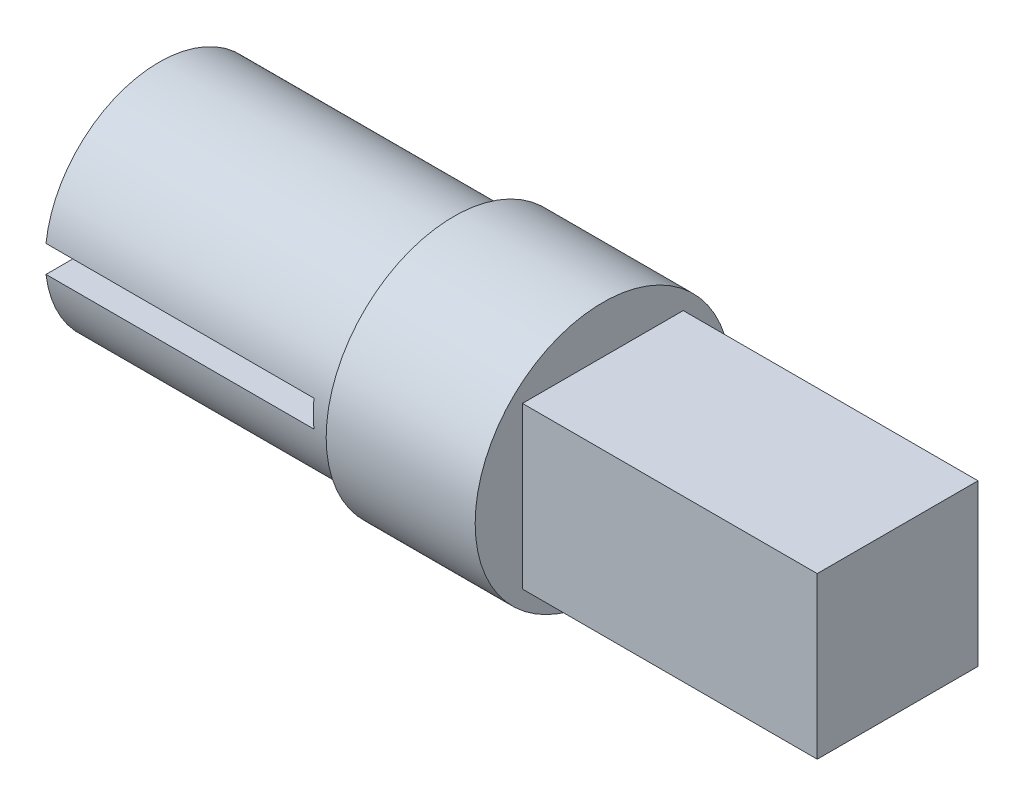
ISO-10303-21;
HEADER;
FILE_DESCRIPTION(('STEP AP214'),'2;1');
FILE_NAME('part.step','',(''),(''),'','','');
FILE_SCHEMA(('AUTOMOTIVE_DESIGN { 1 0 10303 214 1 1 1 1 }'));
ENDSEC;
DATA;
#1=APPLICATION_CONTEXT('core data for automotive mechanical design processes');
#2=APPLICATION_PROTOCOL_DEFINITION('international standard','automotive_design',2000,#1);
#3=PRODUCT_CONTEXT('',#1,'mechanical');
#4=PRODUCT('Part','Part','',(#3));
#5=PRODUCT_RELATED_PRODUCT_CATEGORY('part','',(#4));
#6=PRODUCT_DEFINITION_FORMATION('','',#4);
#7=PRODUCT_DEFINITION_CONTEXT('part definition',#1,'design');
#8=PRODUCT_DEFINITION('design','',#6,#7);
#9=PRODUCT_DEFINITION_SHAPE('','',#8);
#10=(LENGTH_UNIT() NAMED_UNIT(*) SI_UNIT(.MILLI.,.METRE.));
#11=(NAMED_UNIT(*) PLANE_ANGLE_UNIT() SI_UNIT($,.RADIAN.));
#12=(NAMED_UNIT(*) SI_UNIT($,.STERADIAN.) SOLID_ANGLE_UNIT());
#13=UNCERTAINTY_MEASURE_WITH_UNIT(LENGTH_MEASURE(1.E-05),#10,'distance_accuracy_value','');
#14=(GEOMETRIC_REPRESENTATION_CONTEXT(3) GLOBAL_UNCERTAINTY_ASSIGNED_CONTEXT((#13)) GLOBAL_UNIT_ASSIGNED_CONTEXT((#10,
#11,#12)) REPRESENTATION_CONTEXT('',''));
#15=CARTESIAN_POINT('',(0.,0.,0.));
#16=DIRECTION('',(0.,0.,1.));
#17=DIRECTION('',(1.,0.,0.));
#18=AXIS2_PLACEMENT_3D('',#15,#16,#17);
#19=CARTESIAN_POINT('',(-13.78,0.,0.));
#20=DIRECTION('',(1.,0.,0.));
#21=DIRECTION('',(0.,0.,-1.));
#22=AXIS2_PLACEMENT_3D('',#19,#20,#21);
#23=CYLINDRICAL_SURFACE('',#22,4.25);
#24=CARTESIAN_POINT('',(-2.78,0.,0.));
#25=DIRECTION('',(-1.,0.,0.));
#26=DIRECTION('',(0.,0.,1.));
#27=AXIS2_PLACEMENT_3D('',#24,#25,#26);
#28=CIRCLE('',#27,4.25);
#29=CARTESIAN_POINT('',(-2.78,0.,4.25));
#30=VERTEX_POINT('',#29);
#31=EDGE_CURVE('E157',#30,#30,#28,.T.);
#32=ORIENTED_EDGE('',*,*,#31,.T.);
#33=EDGE_LOOP('',(#32));
#34=FACE_BOUND('',#33,.T.);
#35=DIRECTION('',(1.,0.,0.));
#36=VECTOR('',#35,1.);
#37=CARTESIAN_POINT('',(-13.78,0.5,-4.22048575403353));
#38=LINE('',#37,#36);
#39=CARTESIAN_POINT('',(-13.78,0.5,-4.22048575403353));
#40=VERTEX_POINT('',#39);
#41=CARTESIAN_POINT('',(-3.77999999999999,0.5,-4.22048575403353));
#42=VERTEX_POINT('',#41);
#43=EDGE_CURVE('E124',#40,#42,#38,.T.);
#44=ORIENTED_EDGE('',*,*,#43,.F.);
#45=CARTESIAN_POINT('',(-13.78,0.,0.));
#46=DIRECTION('',(-1.,0.,0.));
#47=DIRECTION('',(0.,0.,1.));
#48=AXIS2_PLACEMENT_3D('',#45,#46,#47);
#49=CIRCLE('',#48,4.25);
#50=CARTESIAN_POINT('',(-13.78,0.5,4.22048575403353));
#51=VERTEX_POINT('',#50);
#52=EDGE_CURVE('E138',#51,#40,#49,.T.);
#53=ORIENTED_EDGE('',*,*,#52,.F.);
#54=DIRECTION('',(1.,0.,0.));
#55=VECTOR('',#54,1.);
#56=CARTESIAN_POINT('',(-13.78,0.5,4.22048575403353));
#57=LINE('',#56,#55);
#58=CARTESIAN_POINT('',(-3.77999999999999,0.5,4.22048575403353));
#59=VERTEX_POINT('',#58);
#60=EDGE_CURVE('E142',#59,#51,#57,.F.);
#61=ORIENTED_EDGE('',*,*,#60,.F.);
#62=CARTESIAN_POINT('',(-3.77999999999999,0.,0.));
#63=DIRECTION('',(-1.,0.,0.));
#64=DIRECTION('',(0.,0.,1.));
#65=AXIS2_PLACEMENT_3D('',#62,#63,#64);
#66=CIRCLE('',#65,4.25);
#67=CARTESIAN_POINT('',(-3.77999999999999,-0.5,4.22048575403353));
#68=VERTEX_POINT('',#67);
#69=EDGE_CURVE('E304',#68,#59,#66,.T.);
#70=ORIENTED_EDGE('',*,*,#69,.F.);
#71=DIRECTION('',(1.,0.,0.));
#72=VECTOR('',#71,1.);
#73=CARTESIAN_POINT('',(-13.78,-0.5,4.22048575403353));
#74=LINE('',#73,#72);
#75=CARTESIAN_POINT('',(-13.78,-0.5,4.22048575403353));
#76=VERTEX_POINT('',#75);
#77=EDGE_CURVE('E311',#68,#76,#74,.F.);
#78=ORIENTED_EDGE('',*,*,#77,.T.);
#79=CARTESIAN_POINT('',(-13.78,-0.5,-4.22048575403353));
#80=VERTEX_POINT('',#79);
#81=EDGE_CURVE('E147',#80,#76,#49,.T.);
#82=ORIENTED_EDGE('',*,*,#81,.F.);
#83=DIRECTION('',(1.,0.,0.));
#84=VECTOR('',#83,1.);
#85=CARTESIAN_POINT('',(-13.78,-0.5,-4.22048575403353));
#86=LINE('',#85,#84);
#87=CARTESIAN_POINT('',(-3.77999999999999,-0.5,-4.22048575403353));
#88=VERTEX_POINT('',#87);
#89=EDGE_CURVE('E310',#80,#88,#86,.T.);
#90=ORIENTED_EDGE('',*,*,#89,.T.);
#91=EDGE_CURVE('E140',#42,#88,#66,.T.);
#92=ORIENTED_EDGE('',*,*,#91,.F.);
#93=EDGE_LOOP('',(#44,#53,#61,#70,#78,#82,#90,#92));
#94=FACE_BOUND('',#93,.T.);
#95=ADVANCED_FACE('F33',(#34,#94),#23,.T.);
#96=CARTESIAN_POINT('',(-13.78,0.,0.));
#97=DIRECTION('',(-1.,0.,0.));
#98=DIRECTION('',(0.,0.,1.));
#99=AXIS2_PLACEMENT_3D('',#96,#97,#98);
#100=PLANE('',#99);
#101=ORIENTED_EDGE('',*,*,#52,.T.);
#102=DIRECTION('',(0.,0.,1.));
#103=VECTOR('',#102,1.);
#104=CARTESIAN_POINT('',(-13.78,0.5,0.));
#105=LINE('',#104,#103);
#106=CARTESIAN_POINT('',(-13.78,0.5,-2.80579756931964));
#107=VERTEX_POINT('',#106);
#108=EDGE_CURVE('E120',#40,#107,#105,.T.);
#109=ORIENTED_EDGE('',*,*,#108,.T.);
#110=CARTESIAN_POINT('',(-13.78,0.,0.));
#111=DIRECTION('',(-1.,0.,0.));
#112=DIRECTION('',(0.,0.,1.));
#113=AXIS2_PLACEMENT_3D('',#110,#111,#112);
#114=CIRCLE('',#113,2.85);
#115=CARTESIAN_POINT('',(-13.78,0.5,2.80579756931964));
#116=VERTEX_POINT('',#115);
#117=EDGE_CURVE('E180',#116,#107,#114,.T.);
#118=ORIENTED_EDGE('',*,*,#117,.F.);
#119=EDGE_CURVE('E132',#116,#51,#105,.T.);
#120=ORIENTED_EDGE('',*,*,#119,.T.);
#121=EDGE_LOOP('',(#101,#109,#118,#120));
#122=FACE_BOUND('',#121,.T.);
#123=ADVANCED_FACE('F145',(#122),#100,.T.);
#124=CARTESIAN_POINT('',(5.28101730552664,0.,0.));
#125=DIRECTION('',(-1.,0.,0.));
#126=DIRECTION('',(0.,0.,1.));
#127=AXIS2_PLACEMENT_3D('',#124,#125,#126);
#128=CYLINDRICAL_SURFACE('',#127,2.85);
#129=CARTESIAN_POINT('',(-2.78,0.,0.));
#130=DIRECTION('',(1.,0.,0.));
#131=DIRECTION('',(0.,0.,-1.));
#132=AXIS2_PLACEMENT_3D('',#129,#130,#131);
#133=CIRCLE('',#132,2.85);
#134=CARTESIAN_POINT('',(-2.78,0.,-2.85));
#135=VERTEX_POINT('',#134);
#136=EDGE_CURVE('E182',#135,#135,#133,.F.);
#137=ORIENTED_EDGE('',*,*,#136,.F.);
#138=EDGE_LOOP('',(#137));
#139=FACE_BOUND('',#138,.T.);
#140=DIRECTION('',(-1.,0.,0.));
#141=VECTOR('',#140,1.);
#142=CARTESIAN_POINT('',(5.28101730552664,0.5,-2.80579756931964));
#143=LINE('',#142,#141);
#144=CARTESIAN_POINT('',(-3.77999999999999,0.5,-2.80579756931964));
#145=VERTEX_POINT('',#144);
#146=EDGE_CURVE('E11',#145,#107,#143,.T.);
#147=ORIENTED_EDGE('',*,*,#146,.F.);
#148=CARTESIAN_POINT('',(-3.77999999999999,0.,0.));
#149=DIRECTION('',(-1.,0.,0.));
#150=DIRECTION('',(0.,0.,1.));
#151=AXIS2_PLACEMENT_3D('',#148,#149,#150);
#152=CIRCLE('',#151,2.85);
#153=CARTESIAN_POINT('',(-3.77999999999999,-0.5,-2.80579756931964));
#154=VERTEX_POINT('',#153);
#155=EDGE_CURVE('E165',#154,#145,#152,.F.);
#156=ORIENTED_EDGE('',*,*,#155,.F.);
#157=DIRECTION('',(-1.,0.,0.));
#158=VECTOR('',#157,1.);
#159=CARTESIAN_POINT('',(5.28101730552664,-0.5,-2.80579756931964));
#160=LINE('',#159,#158);
#161=CARTESIAN_POINT('',(-13.78,-0.5,-2.80579756931964));
#162=VERTEX_POINT('',#161);
#163=EDGE_CURVE('E41',#154,#162,#160,.T.);
#164=ORIENTED_EDGE('',*,*,#163,.T.);
#165=CARTESIAN_POINT('',(-13.78,-0.5,2.80579756931964));
#166=VERTEX_POINT('',#165);
#167=EDGE_CURVE('E141',#162,#166,#114,.T.);
#168=ORIENTED_EDGE('',*,*,#167,.T.);
#169=DIRECTION('',(-1.,0.,0.));
#170=VECTOR('',#169,1.);
#171=CARTESIAN_POINT('',(5.28101730552664,-0.5,2.80579756931964));
#172=LINE('',#171,#170);
#173=CARTESIAN_POINT('',(-3.77999999999999,-0.5,2.80579756931964));
#174=VERTEX_POINT('',#173);
#175=EDGE_CURVE('E164',#166,#174,#172,.F.);
#176=ORIENTED_EDGE('',*,*,#175,.T.);
#177=CARTESIAN_POINT('',(-3.77999999999999,0.5,2.80579756931964));
#178=VERTEX_POINT('',#177);
#179=EDGE_CURVE('E160',#178,#174,#152,.F.);
#180=ORIENTED_EDGE('',*,*,#179,.F.);
#181=DIRECTION('',(-1.,0.,0.));
#182=VECTOR('',#181,1.);
#183=CARTESIAN_POINT('',(5.28101730552664,0.5,2.80579756931964));
#184=LINE('',#183,#182);
#185=EDGE_CURVE('E168',#116,#178,#184,.F.);
#186=ORIENTED_EDGE('',*,*,#185,.F.);
#187=ORIENTED_EDGE('',*,*,#117,.T.);
#188=EDGE_LOOP('',(#147,#156,#164,#168,#176,#180,#186,#187));
#189=FACE_BOUND('',#188,.T.);
#190=ADVANCED_FACE('F178',(#139,#189),#128,.F.);
#191=CARTESIAN_POINT('',(2.78,0.,0.));
#192=DIRECTION('',(-1.,0.,0.));
#193=DIRECTION('',(0.,0.,1.));
#194=AXIS2_PLACEMENT_3D('',#191,#192,#193);
#195=CYLINDRICAL_SURFACE('',#194,4.765);
#196=CARTESIAN_POINT('',(2.78,0.,0.));
#197=DIRECTION('',(1.,0.,0.));
#198=DIRECTION('',(0.,0.,-1.));
#199=AXIS2_PLACEMENT_3D('',#196,#197,#198);
#200=CIRCLE('',#199,4.765);
#201=CARTESIAN_POINT('',(2.78,0.,-4.765));
#202=VERTEX_POINT('',#201);
#203=EDGE_CURVE('E150',#202,#202,#200,.T.);
#204=ORIENTED_EDGE('',*,*,#203,.F.);
#205=EDGE_LOOP('',(#204));
#206=FACE_BOUND('',#205,.T.);
#207=CARTESIAN_POINT('',(-2.78,0.,0.));
#208=DIRECTION('',(1.,0.,0.));
#209=DIRECTION('',(0.,0.,-1.));
#210=AXIS2_PLACEMENT_3D('',#207,#208,#209);
#211=CIRCLE('',#210,4.765);
#212=CARTESIAN_POINT('',(-2.78,0.,-4.765));
#213=VERTEX_POINT('',#212);
#214=EDGE_CURVE('E146',#213,#213,#211,.T.);
#215=ORIENTED_EDGE('',*,*,#214,.T.);
#216=EDGE_LOOP('',(#215));
#217=FACE_BOUND('',#216,.T.);
#218=ADVANCED_FACE('F35',(#206,#217),#195,.T.);
#219=CARTESIAN_POINT('',(2.78,0.,0.));
#220=DIRECTION('',(1.,0.,0.));
#221=DIRECTION('',(0.,0.,-1.));
#222=AXIS2_PLACEMENT_3D('',#219,#220,#221);
#223=PLANE('',#222);
#224=DIRECTION('',(0.,1.,0.));
#225=VECTOR('',#224,1.);
#226=CARTESIAN_POINT('',(2.78,3.,-3.));
#227=LINE('',#226,#225);
#228=CARTESIAN_POINT('',(2.78,-3.,-3.));
#229=VERTEX_POINT('',#228);
#230=CARTESIAN_POINT('',(2.78,3.,-3.));
#231=VERTEX_POINT('',#230);
#232=EDGE_CURVE('E185',#229,#231,#227,.T.);
#233=ORIENTED_EDGE('',*,*,#232,.F.);
#234=DIRECTION('',(0.,0.,-1.));
#235=VECTOR('',#234,1.);
#236=CARTESIAN_POINT('',(2.78,-3.,3.));
#237=LINE('',#236,#235);
#238=CARTESIAN_POINT('',(2.78,-3.,3.));
#239=VERTEX_POINT('',#238);
#240=EDGE_CURVE('E193',#239,#229,#237,.T.);
#241=ORIENTED_EDGE('',*,*,#240,.F.);
#242=DIRECTION('',(0.,-1.,0.));
#243=VECTOR('',#242,1.);
#244=CARTESIAN_POINT('',(2.78,3.,3.));
#245=LINE('',#244,#243);
#246=CARTESIAN_POINT('',(2.78,3.,3.));
#247=VERTEX_POINT('',#246);
#248=EDGE_CURVE('E205',#247,#239,#245,.T.);
#249=ORIENTED_EDGE('',*,*,#248,.F.);
#250=DIRECTION('',(0.,0.,1.));
#251=VECTOR('',#250,1.);
#252=CARTESIAN_POINT('',(2.78,3.,3.));
#253=LINE('',#252,#251);
#254=EDGE_CURVE('E202',#231,#247,#253,.T.);
#255=ORIENTED_EDGE('',*,*,#254,.F.);
#256=EDGE_LOOP('',(#233,#241,#249,#255));
#257=FACE_BOUND('',#256,.T.);
#258=ORIENTED_EDGE('',*,*,#203,.T.);
#259=EDGE_LOOP('',(#258));
#260=FACE_BOUND('',#259,.T.);
#261=ADVANCED_FACE('F228',(#257,#260),#223,.T.);
#262=CARTESIAN_POINT('',(-2.78,0.,0.));
#263=DIRECTION('',(1.,0.,0.));
#264=DIRECTION('',(0.,0.,-1.));
#265=AXIS2_PLACEMENT_3D('',#262,#263,#264);
#266=PLANE('',#265);
#267=ORIENTED_EDGE('',*,*,#31,.F.);
#268=EDGE_LOOP('',(#267));
#269=FACE_BOUND('',#268,.T.);
#270=ORIENTED_EDGE('',*,*,#214,.F.);
#271=EDGE_LOOP('',(#270));
#272=FACE_BOUND('',#271,.T.);
#273=ADVANCED_FACE('F260',(#269,#272),#266,.F.);
#274=DIRECTION('',(0.,0.,1.));
#275=VECTOR('',#274,1.);
#276=CARTESIAN_POINT('',(-13.78,-0.5,0.));
#277=LINE('',#276,#275);
#278=EDGE_CURVE('E309',#80,#162,#277,.T.);
#279=ORIENTED_EDGE('',*,*,#278,.F.);
#280=ORIENTED_EDGE('',*,*,#81,.T.);
#281=EDGE_CURVE('E131',#166,#76,#277,.T.);
#282=ORIENTED_EDGE('',*,*,#281,.F.);
#283=ORIENTED_EDGE('',*,*,#167,.F.);
#284=EDGE_LOOP('',(#279,#280,#282,#283));
#285=FACE_BOUND('',#284,.T.);
#286=ADVANCED_FACE('F256',(#285),#100,.T.);
#287=CARTESIAN_POINT('',(13.78,3.,-3.));
#288=DIRECTION('',(0.,0.,1.));
#289=DIRECTION('',(0.,-1.,0.));
#290=AXIS2_PLACEMENT_3D('',#287,#288,#289);
#291=PLANE('',#290);
#292=ORIENTED_EDGE('',*,*,#232,.T.);
#293=DIRECTION('',(-1.,0.,0.));
#294=VECTOR('',#293,1.);
#295=CARTESIAN_POINT('',(13.78,3.,-3.));
#296=LINE('',#295,#294);
#297=CARTESIAN_POINT('',(13.78,3.,-3.));
#298=VERTEX_POINT('',#297);
#299=EDGE_CURVE('E153',#298,#231,#296,.T.);
#300=ORIENTED_EDGE('',*,*,#299,.F.);
#301=DIRECTION('',(0.,1.,0.));
#302=VECTOR('',#301,1.);
#303=CARTESIAN_POINT('',(13.78,3.,-3.));
#304=LINE('',#303,#302);
#305=CARTESIAN_POINT('',(13.78,-3.,-3.));
#306=VERTEX_POINT('',#305);
#307=EDGE_CURVE('E189',#306,#298,#304,.T.);
#308=ORIENTED_EDGE('',*,*,#307,.F.);
#309=DIRECTION('',(-1.,0.,0.));
#310=VECTOR('',#309,1.);
#311=CARTESIAN_POINT('',(13.78,-3.,-3.));
#312=LINE('',#311,#310);
#313=EDGE_CURVE('E199',#306,#229,#312,.T.);
#314=ORIENTED_EDGE('',*,*,#313,.T.);
#315=EDGE_LOOP('',(#292,#300,#308,#314));
#316=FACE_BOUND('',#315,.T.);
#317=ADVANCED_FACE('F225',(#316),#291,.F.);
#318=CARTESIAN_POINT('',(13.78,3.,3.));
#319=DIRECTION('',(0.,-1.,0.));
#320=DIRECTION('',(0.,0.,-1.));
#321=AXIS2_PLACEMENT_3D('',#318,#319,#320);
#322=PLANE('',#321);
#323=ORIENTED_EDGE('',*,*,#254,.T.);
#324=DIRECTION('',(-1.,0.,0.));
#325=VECTOR('',#324,1.);
#326=CARTESIAN_POINT('',(13.78,3.,3.));
#327=LINE('',#326,#325);
#328=CARTESIAN_POINT('',(13.78,3.,3.));
#329=VERTEX_POINT('',#328);
#330=EDGE_CURVE('E214',#329,#247,#327,.T.);
#331=ORIENTED_EDGE('',*,*,#330,.F.);
#332=DIRECTION('',(0.,0.,1.));
#333=VECTOR('',#332,1.);
#334=CARTESIAN_POINT('',(13.78,3.,3.));
#335=LINE('',#334,#333);
#336=EDGE_CURVE('E192',#298,#329,#335,.T.);
#337=ORIENTED_EDGE('',*,*,#336,.F.);
#338=ORIENTED_EDGE('',*,*,#299,.T.);
#339=EDGE_LOOP('',(#323,#331,#337,#338));
#340=FACE_BOUND('',#339,.T.);
#341=ADVANCED_FACE('F222',(#340),#322,.F.);
#342=CARTESIAN_POINT('',(13.78,3.,3.));
#343=DIRECTION('',(0.,0.,-1.));
#344=DIRECTION('',(0.,1.,0.));
#345=AXIS2_PLACEMENT_3D('',#342,#343,#344);
#346=PLANE('',#345);
#347=ORIENTED_EDGE('',*,*,#248,.T.);
#348=DIRECTION('',(-1.,0.,0.));
#349=VECTOR('',#348,1.);
#350=CARTESIAN_POINT('',(13.78,-3.,3.));
#351=LINE('',#350,#349);
#352=CARTESIAN_POINT('',(13.78,-3.,3.));
#353=VERTEX_POINT('',#352);
#354=EDGE_CURVE('E212',#353,#239,#351,.T.);
#355=ORIENTED_EDGE('',*,*,#354,.F.);
#356=DIRECTION('',(0.,-1.,0.));
#357=VECTOR('',#356,1.);
#358=CARTESIAN_POINT('',(13.78,3.,3.));
#359=LINE('',#358,#357);
#360=EDGE_CURVE('E195',#329,#353,#359,.T.);
#361=ORIENTED_EDGE('',*,*,#360,.F.);
#362=ORIENTED_EDGE('',*,*,#330,.T.);
#363=EDGE_LOOP('',(#347,#355,#361,#362));
#364=FACE_BOUND('',#363,.T.);
#365=ADVANCED_FACE('F234',(#364),#346,.F.);
#366=CARTESIAN_POINT('',(13.78,-3.,3.));
#367=DIRECTION('',(0.,1.,0.));
#368=DIRECTION('',(0.,0.,1.));
#369=AXIS2_PLACEMENT_3D('',#366,#367,#368);
#370=PLANE('',#369);
#371=ORIENTED_EDGE('',*,*,#240,.T.);
#372=ORIENTED_EDGE('',*,*,#313,.F.);
#373=DIRECTION('',(0.,0.,-1.));
#374=VECTOR('',#373,1.);
#375=CARTESIAN_POINT('',(13.78,-3.,3.));
#376=LINE('',#375,#374);
#377=EDGE_CURVE('E197',#353,#306,#376,.T.);
#378=ORIENTED_EDGE('',*,*,#377,.F.);
#379=ORIENTED_EDGE('',*,*,#354,.T.);
#380=EDGE_LOOP('',(#371,#372,#378,#379));
#381=FACE_BOUND('',#380,.T.);
#382=ADVANCED_FACE('F231',(#381),#370,.F.);
#383=CARTESIAN_POINT('',(13.78,0.,0.));
#384=DIRECTION('',(1.,0.,0.));
#385=DIRECTION('',(0.,0.,-1.));
#386=AXIS2_PLACEMENT_3D('',#383,#384,#385);
#387=PLANE('',#386);
#388=ORIENTED_EDGE('',*,*,#307,.T.);
#389=ORIENTED_EDGE('',*,*,#336,.T.);
#390=ORIENTED_EDGE('',*,*,#360,.T.);
#391=ORIENTED_EDGE('',*,*,#377,.T.);
#392=EDGE_LOOP('',(#388,#389,#390,#391));
#393=FACE_BOUND('',#392,.T.);
#394=ADVANCED_FACE('F236',(#393),#387,.T.);
#395=CARTESIAN_POINT('',(-2.78,0.,0.));
#396=DIRECTION('',(1.,0.,0.));
#397=DIRECTION('',(0.,0.,-1.));
#398=AXIS2_PLACEMENT_3D('',#395,#396,#397);
#399=PLANE('',#398);
#400=ORIENTED_EDGE('',*,*,#136,.T.);
#401=EDGE_LOOP('',(#400));
#402=FACE_BOUND('',#401,.T.);
#403=ADVANCED_FACE('F238',(#402),#399,.F.);
#404=CARTESIAN_POINT('',(-3.77999999999999,0.,0.));
#405=DIRECTION('',(-1.,0.,0.));
#406=DIRECTION('',(0.,0.,1.));
#407=AXIS2_PLACEMENT_3D('',#404,#405,#406);
#408=PLANE('',#407);
#409=ORIENTED_EDGE('',*,*,#69,.T.);
#410=DIRECTION('',(0.,0.,1.));
#411=VECTOR('',#410,1.);
#412=CARTESIAN_POINT('',(-3.77999999999999,0.5,0.));
#413=LINE('',#412,#411);
#414=EDGE_CURVE('E56',#178,#59,#413,.T.);
#415=ORIENTED_EDGE('',*,*,#414,.F.);
#416=ORIENTED_EDGE('',*,*,#179,.T.);
#417=DIRECTION('',(0.,0.,1.));
#418=VECTOR('',#417,1.);
#419=CARTESIAN_POINT('',(-3.77999999999999,-0.5,0.));
#420=LINE('',#419,#418);
#421=EDGE_CURVE('E176',#174,#68,#420,.T.);
#422=ORIENTED_EDGE('',*,*,#421,.T.);
#423=EDGE_LOOP('',(#409,#415,#416,#422));
#424=FACE_BOUND('',#423,.T.);
#425=ADVANCED_FACE('F244',(#424),#408,.T.);
#426=CARTESIAN_POINT('',(-3.77999999999999,-0.5,0.));
#427=DIRECTION('',(0.,-1.,0.));
#428=DIRECTION('',(0.,0.,-1.));
#429=AXIS2_PLACEMENT_3D('',#426,#427,#428);
#430=PLANE('',#429);
#431=ORIENTED_EDGE('',*,*,#421,.F.);
#432=ORIENTED_EDGE('',*,*,#175,.F.);
#433=ORIENTED_EDGE('',*,*,#281,.T.);
#434=ORIENTED_EDGE('',*,*,#77,.F.);
#435=EDGE_LOOP('',(#431,#432,#433,#434));
#436=FACE_BOUND('',#435,.T.);
#437=ADVANCED_FACE('F293',(#436),#430,.F.);
#438=CARTESIAN_POINT('',(-3.77999999999999,0.5,0.));
#439=DIRECTION('',(0.,-1.,0.));
#440=DIRECTION('',(0.,0.,-1.));
#441=AXIS2_PLACEMENT_3D('',#438,#439,#440);
#442=PLANE('',#441);
#443=ORIENTED_EDGE('',*,*,#60,.T.);
#444=ORIENTED_EDGE('',*,*,#119,.F.);
#445=ORIENTED_EDGE('',*,*,#185,.T.);
#446=ORIENTED_EDGE('',*,*,#414,.T.);
#447=EDGE_LOOP('',(#443,#444,#445,#446));
#448=FACE_BOUND('',#447,.T.);
#449=ADVANCED_FACE('F289',(#448),#442,.T.);
#450=ORIENTED_EDGE('',*,*,#43,.T.);
#451=EDGE_CURVE('E175',#42,#145,#413,.T.);
#452=ORIENTED_EDGE('',*,*,#451,.T.);
#453=ORIENTED_EDGE('',*,*,#146,.T.);
#454=ORIENTED_EDGE('',*,*,#108,.F.);
#455=EDGE_LOOP('',(#450,#452,#453,#454));
#456=FACE_BOUND('',#455,.T.);
#457=ADVANCED_FACE('F122',(#456),#442,.T.);
#458=ORIENTED_EDGE('',*,*,#278,.T.);
#459=ORIENTED_EDGE('',*,*,#163,.F.);
#460=EDGE_CURVE('E48',#88,#154,#420,.T.);
#461=ORIENTED_EDGE('',*,*,#460,.F.);
#462=ORIENTED_EDGE('',*,*,#89,.F.);
#463=EDGE_LOOP('',(#458,#459,#461,#462));
#464=FACE_BOUND('',#463,.T.);
#465=ADVANCED_FACE('F288',(#464),#430,.F.);
#466=ORIENTED_EDGE('',*,*,#91,.T.);
#467=ORIENTED_EDGE('',*,*,#460,.T.);
#468=ORIENTED_EDGE('',*,*,#155,.T.);
#469=ORIENTED_EDGE('',*,*,#451,.F.);
#470=EDGE_LOOP('',(#466,#467,#468,#469));
#471=FACE_BOUND('',#470,.T.);
#472=ADVANCED_FACE('F174',(#471),#408,.T.);
#473=CLOSED_SHELL('',(#95,#123,#190,#218,#261,#273,#286,#317,#341,#365,#382,#394,#403,#425,#437,
#449,#457,#465,#472));
#474=MANIFOLD_SOLID_BREP('B2',#473);
#475=ADVANCED_BREP_SHAPE_REPRESENTATION('',(#18,#474),#14);
#476=SHAPE_DEFINITION_REPRESENTATION(#9,#475);
ENDSEC;
END-ISO-10303-21;
